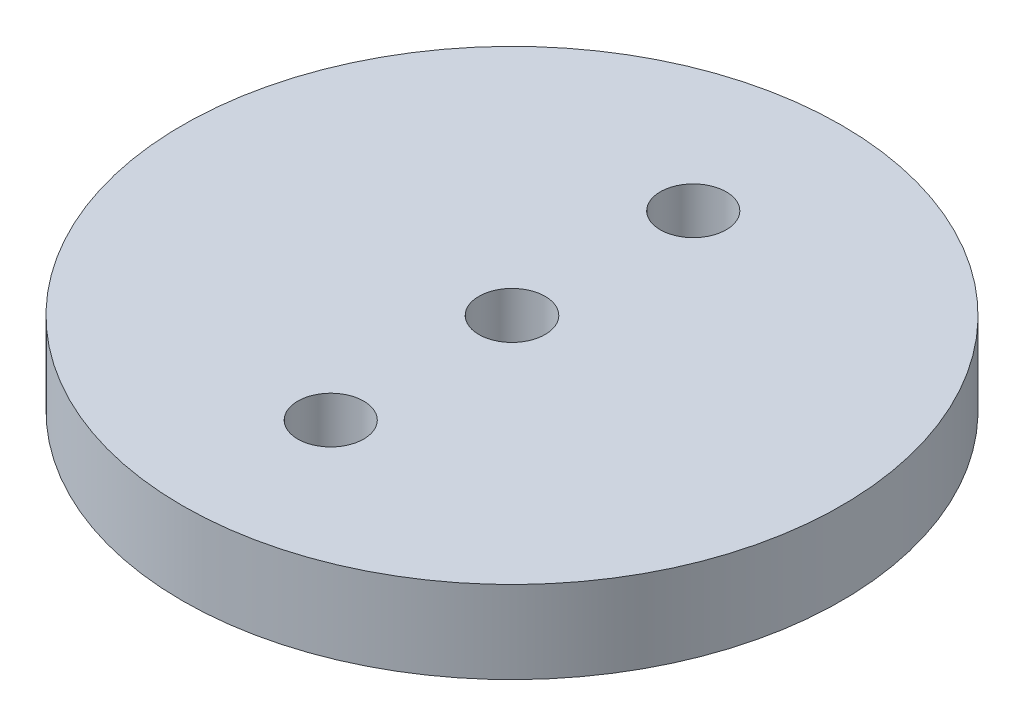
ISO-10303-21;
HEADER;
FILE_DESCRIPTION(('STEP AP214'),'2;1');
FILE_NAME('part.step','',(''),(''),'','','');
FILE_SCHEMA(('AUTOMOTIVE_DESIGN { 1 0 10303 214 1 1 1 1 }'));
ENDSEC;
DATA;
#1=APPLICATION_CONTEXT('core data for automotive mechanical design processes');
#2=APPLICATION_PROTOCOL_DEFINITION('international standard','automotive_design',2000,#1);
#3=PRODUCT_CONTEXT('',#1,'mechanical');
#4=PRODUCT('Part','Part','',(#3));
#5=PRODUCT_RELATED_PRODUCT_CATEGORY('part','',(#4));
#6=PRODUCT_DEFINITION_FORMATION('','',#4);
#7=PRODUCT_DEFINITION_CONTEXT('part definition',#1,'design');
#8=PRODUCT_DEFINITION('design','',#6,#7);
#9=PRODUCT_DEFINITION_SHAPE('','',#8);
#10=(LENGTH_UNIT() NAMED_UNIT(*) SI_UNIT(.MILLI.,.METRE.));
#11=(NAMED_UNIT(*) PLANE_ANGLE_UNIT() SI_UNIT($,.RADIAN.));
#12=(NAMED_UNIT(*) SI_UNIT($,.STERADIAN.) SOLID_ANGLE_UNIT());
#13=UNCERTAINTY_MEASURE_WITH_UNIT(LENGTH_MEASURE(1.E-05),#10,'distance_accuracy_value','');
#14=(GEOMETRIC_REPRESENTATION_CONTEXT(3) GLOBAL_UNCERTAINTY_ASSIGNED_CONTEXT((#13)) GLOBAL_UNIT_ASSIGNED_CONTEXT((#10,
#11,#12)) REPRESENTATION_CONTEXT('',''));
#15=CARTESIAN_POINT('',(0.,0.,0.));
#16=DIRECTION('',(0.,0.,1.));
#17=DIRECTION('',(1.,0.,0.));
#18=AXIS2_PLACEMENT_3D('',#15,#16,#17);
#19=CARTESIAN_POINT('',(0.,6.35,0.));
#20=DIRECTION('',(0.,1.,0.));
#21=DIRECTION('',(0.,0.,1.));
#22=AXIS2_PLACEMENT_3D('',#19,#20,#21);
#23=PLANE('',#22);
#24=CARTESIAN_POINT('',(0.,6.35,-13.97));
#25=DIRECTION('',(0.,1.,0.));
#26=DIRECTION('',(0.,0.,1.));
#27=AXIS2_PLACEMENT_3D('',#24,#25,#26);
#28=CIRCLE('',#27,2.53999999999996);
#29=CARTESIAN_POINT('',(0.,6.35,-11.4300000000001));
#30=VERTEX_POINT('',#29);
#31=EDGE_CURVE('E52',#30,#30,#28,.T.);
#32=ORIENTED_EDGE('',*,*,#31,.F.);
#33=EDGE_LOOP('',(#32));
#34=FACE_BOUND('',#33,.T.);
#35=CARTESIAN_POINT('',(0.,6.35,0.));
#36=DIRECTION('',(0.,1.,0.));
#37=DIRECTION('',(0.,0.,1.));
#38=AXIS2_PLACEMENT_3D('',#35,#36,#37);
#39=CIRCLE('',#38,25.4);
#40=CARTESIAN_POINT('',(0.,6.35,25.4));
#41=VERTEX_POINT('',#40);
#42=EDGE_CURVE('E10',#41,#41,#39,.T.);
#43=ORIENTED_EDGE('',*,*,#42,.T.);
#44=EDGE_LOOP('',(#43));
#45=FACE_BOUND('',#44,.T.);
#46=CARTESIAN_POINT('',(0.,6.35,0.));
#47=DIRECTION('',(0.,1.,0.));
#48=DIRECTION('',(0.,0.,1.));
#49=AXIS2_PLACEMENT_3D('',#46,#47,#48);
#50=CIRCLE('',#49,2.55269999999992);
#51=CARTESIAN_POINT('',(0.,6.35,2.55269999999992));
#52=VERTEX_POINT('',#51);
#53=EDGE_CURVE('E48',#52,#52,#50,.T.);
#54=ORIENTED_EDGE('',*,*,#53,.F.);
#55=EDGE_LOOP('',(#54));
#56=FACE_BOUND('',#55,.T.);
#57=CARTESIAN_POINT('',(0.,6.35,13.97));
#58=DIRECTION('',(0.,1.,0.));
#59=DIRECTION('',(0.,0.,1.));
#60=AXIS2_PLACEMENT_3D('',#57,#58,#59);
#61=CIRCLE('',#60,2.53999999999996);
#62=CARTESIAN_POINT('',(0.,6.35,16.51));
#63=VERTEX_POINT('',#62);
#64=EDGE_CURVE('E56',#63,#63,#61,.T.);
#65=ORIENTED_EDGE('',*,*,#64,.F.);
#66=EDGE_LOOP('',(#65));
#67=FACE_BOUND('',#66,.T.);
#68=ADVANCED_FACE('F40',(#34,#45,#56,#67),#23,.T.);
#69=CARTESIAN_POINT('',(0.,0.,0.));
#70=DIRECTION('',(0.,1.,0.));
#71=DIRECTION('',(0.,0.,1.));
#72=AXIS2_PLACEMENT_3D('',#69,#70,#71);
#73=PLANE('',#72);
#74=CARTESIAN_POINT('',(0.,0.,0.));
#75=DIRECTION('',(0.,1.,0.));
#76=DIRECTION('',(0.,0.,1.));
#77=AXIS2_PLACEMENT_3D('',#74,#75,#76);
#78=CIRCLE('',#77,25.4);
#79=CARTESIAN_POINT('',(0.,0.,25.4));
#80=VERTEX_POINT('',#79);
#81=EDGE_CURVE('E41',#80,#80,#78,.T.);
#82=ORIENTED_EDGE('',*,*,#81,.F.);
#83=EDGE_LOOP('',(#82));
#84=FACE_BOUND('',#83,.T.);
#85=CARTESIAN_POINT('',(0.,0.,0.));
#86=DIRECTION('',(0.,1.,0.));
#87=DIRECTION('',(0.,0.,1.));
#88=AXIS2_PLACEMENT_3D('',#85,#86,#87);
#89=CIRCLE('',#88,2.55269999999992);
#90=CARTESIAN_POINT('',(0.,0.,2.55269999999992));
#91=VERTEX_POINT('',#90);
#92=EDGE_CURVE('E49',#91,#91,#89,.T.);
#93=ORIENTED_EDGE('',*,*,#92,.T.);
#94=EDGE_LOOP('',(#93));
#95=FACE_BOUND('',#94,.T.);
#96=CARTESIAN_POINT('',(0.,0.,-13.97));
#97=DIRECTION('',(0.,1.,0.));
#98=DIRECTION('',(0.,0.,1.));
#99=AXIS2_PLACEMENT_3D('',#96,#97,#98);
#100=CIRCLE('',#99,2.53999999999996);
#101=CARTESIAN_POINT('',(0.,0.,-11.4300000000001));
#102=VERTEX_POINT('',#101);
#103=EDGE_CURVE('E57',#102,#102,#100,.T.);
#104=ORIENTED_EDGE('',*,*,#103,.T.);
#105=EDGE_LOOP('',(#104));
#106=FACE_BOUND('',#105,.T.);
#107=CARTESIAN_POINT('',(0.,0.,13.97));
#108=DIRECTION('',(0.,1.,0.));
#109=DIRECTION('',(0.,0.,1.));
#110=AXIS2_PLACEMENT_3D('',#107,#108,#109);
#111=CIRCLE('',#110,2.53999999999996);
#112=CARTESIAN_POINT('',(0.,0.,16.51));
#113=VERTEX_POINT('',#112);
#114=EDGE_CURVE('E62',#113,#113,#111,.T.);
#115=ORIENTED_EDGE('',*,*,#114,.T.);
#116=EDGE_LOOP('',(#115));
#117=FACE_BOUND('',#116,.T.);
#118=ADVANCED_FACE('F72',(#84,#95,#106,#117),#73,.F.);
#119=CARTESIAN_POINT('',(0.,6.35,0.));
#120=DIRECTION('',(0.,-1.,0.));
#121=DIRECTION('',(0.,0.,-1.));
#122=AXIS2_PLACEMENT_3D('',#119,#120,#121);
#123=CYLINDRICAL_SURFACE('',#122,25.4);
#124=ORIENTED_EDGE('',*,*,#42,.F.);
#125=EDGE_LOOP('',(#124));
#126=FACE_BOUND('',#125,.T.);
#127=ORIENTED_EDGE('',*,*,#81,.T.);
#128=EDGE_LOOP('',(#127));
#129=FACE_BOUND('',#128,.T.);
#130=ADVANCED_FACE('F39',(#126,#129),#123,.T.);
#131=CARTESIAN_POINT('',(0.,6.35,0.));
#132=DIRECTION('',(0.,-1.,0.));
#133=DIRECTION('',(0.,0.,-1.));
#134=AXIS2_PLACEMENT_3D('',#131,#132,#133);
#135=CYLINDRICAL_SURFACE('',#134,2.55269999999992);
#136=ORIENTED_EDGE('',*,*,#53,.T.);
#137=EDGE_LOOP('',(#136));
#138=FACE_BOUND('',#137,.T.);
#139=ORIENTED_EDGE('',*,*,#92,.F.);
#140=EDGE_LOOP('',(#139));
#141=FACE_BOUND('',#140,.T.);
#142=ADVANCED_FACE('F83',(#138,#141),#135,.F.);
#143=CARTESIAN_POINT('',(0.,6.35,-13.97));
#144=DIRECTION('',(0.,-1.,0.));
#145=DIRECTION('',(0.,0.,-1.));
#146=AXIS2_PLACEMENT_3D('',#143,#144,#145);
#147=CYLINDRICAL_SURFACE('',#146,2.53999999999996);
#148=ORIENTED_EDGE('',*,*,#31,.T.);
#149=EDGE_LOOP('',(#148));
#150=FACE_BOUND('',#149,.T.);
#151=ORIENTED_EDGE('',*,*,#103,.F.);
#152=EDGE_LOOP('',(#151));
#153=FACE_BOUND('',#152,.T.);
#154=ADVANCED_FACE('F84',(#150,#153),#147,.F.);
#155=CARTESIAN_POINT('',(0.,6.35,13.97));
#156=DIRECTION('',(0.,-1.,0.));
#157=DIRECTION('',(0.,0.,-1.));
#158=AXIS2_PLACEMENT_3D('',#155,#156,#157);
#159=CYLINDRICAL_SURFACE('',#158,2.53999999999996);
#160=ORIENTED_EDGE('',*,*,#64,.T.);
#161=EDGE_LOOP('',(#160));
#162=FACE_BOUND('',#161,.T.);
#163=ORIENTED_EDGE('',*,*,#114,.F.);
#164=EDGE_LOOP('',(#163));
#165=FACE_BOUND('',#164,.T.);
#166=ADVANCED_FACE('F66',(#162,#165),#159,.F.);
#167=CLOSED_SHELL('',(#68,#118,#130,#142,#154,#166));
#168=MANIFOLD_SOLID_BREP('B2',#167);
#169=ADVANCED_BREP_SHAPE_REPRESENTATION('',(#18,#168),#14);
#170=SHAPE_DEFINITION_REPRESENTATION(#9,#169);
ENDSEC;
END-ISO-10303-21;
